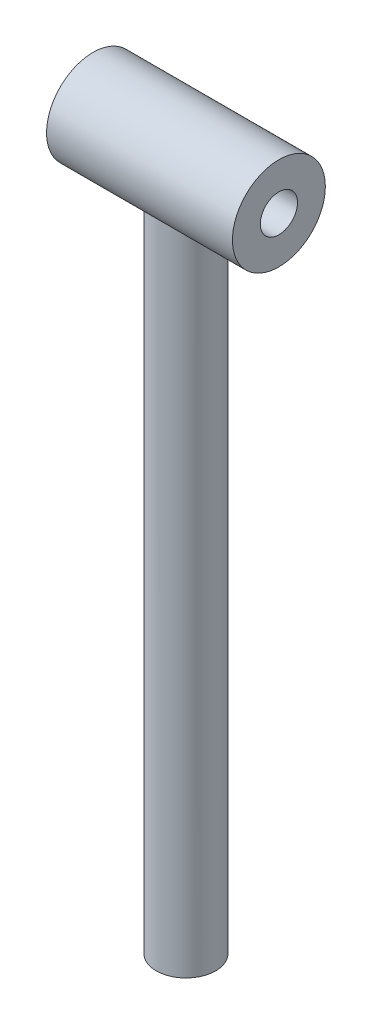
ISO-10303-21;
HEADER;
FILE_DESCRIPTION(('STEP AP214'),'2;1');
FILE_NAME('part.step','',(''),(''),'','','');
FILE_SCHEMA(('AUTOMOTIVE_DESIGN { 1 0 10303 214 1 1 1 1 }'));
ENDSEC;
DATA;
#1=APPLICATION_CONTEXT('core data for automotive mechanical design processes');
#2=APPLICATION_PROTOCOL_DEFINITION('international standard','automotive_design',2000,#1);
#3=PRODUCT_CONTEXT('',#1,'mechanical');
#4=PRODUCT('Part','Part','',(#3));
#5=PRODUCT_RELATED_PRODUCT_CATEGORY('part','',(#4));
#6=PRODUCT_DEFINITION_FORMATION('','',#4);
#7=PRODUCT_DEFINITION_CONTEXT('part definition',#1,'design');
#8=PRODUCT_DEFINITION('design','',#6,#7);
#9=PRODUCT_DEFINITION_SHAPE('','',#8);
#10=(LENGTH_UNIT() NAMED_UNIT(*) SI_UNIT(.MILLI.,.METRE.));
#11=(NAMED_UNIT(*) PLANE_ANGLE_UNIT() SI_UNIT($,.RADIAN.));
#12=(NAMED_UNIT(*) SI_UNIT($,.STERADIAN.) SOLID_ANGLE_UNIT());
#13=UNCERTAINTY_MEASURE_WITH_UNIT(LENGTH_MEASURE(1.E-05),#10,'distance_accuracy_value','');
#14=(GEOMETRIC_REPRESENTATION_CONTEXT(3) GLOBAL_UNCERTAINTY_ASSIGNED_CONTEXT((#13)) GLOBAL_UNIT_ASSIGNED_CONTEXT((#10,
#11,#12)) REPRESENTATION_CONTEXT('',''));
#15=CARTESIAN_POINT('',(0.,0.,0.));
#16=DIRECTION('',(0.,0.,1.));
#17=DIRECTION('',(1.,0.,0.));
#18=AXIS2_PLACEMENT_3D('',#15,#16,#17);
#19=CARTESIAN_POINT('',(-25.,0.,0.));
#20=DIRECTION('',(1.,0.,0.));
#21=DIRECTION('',(0.,0.,-1.));
#22=AXIS2_PLACEMENT_3D('',#19,#20,#21);
#23=CYLINDRICAL_SURFACE('',#22,12.5);
#24=CARTESIAN_POINT('',(0.,-9.6046863561493,8.));
#25=CARTESIAN_POINT('',(-0.197725600196772,-9.6046800226182,8.00000388704961));
#26=CARTESIAN_POINT('',(-0.395415066736677,-9.61081406317906,7.99265931078488));
#27=CARTESIAN_POINT('',(-0.789048350977257,-9.63504143002822,7.96343815709887));
#28=CARTESIAN_POINT('',(-0.984991586034905,-9.65313860686967,7.94155690077122));
#29=CARTESIAN_POINT('',(-1.37365233767129,-9.70049673664764,7.88363816772753));
#30=CARTESIAN_POINT('',(-1.56636511820122,-9.72977279937815,7.84758152908222));
#31=CARTESIAN_POINT('',(-1.94702601705191,-9.79825621718616,7.76190541787049));
#32=CARTESIAN_POINT('',(-2.1349717112703,-9.83746851779271,7.71227919038429));
#33=CARTESIAN_POINT('',(-2.5032205789313,-9.92392883200194,7.6006948964739));
#34=CARTESIAN_POINT('',(-2.68357883488757,-9.9710981654028,7.53885664999728));
#35=CARTESIAN_POINT('',(-3.03783429520806,-10.0722191297971,7.4032125442021));
#36=CARTESIAN_POINT('',(-3.21172899354017,-10.1261733565952,7.32940210134052));
#37=CARTESIAN_POINT('',(-3.55243957989145,-10.239336126136,7.17046077766628));
#38=CARTESIAN_POINT('',(-3.71925646235044,-10.2985439271088,7.08533149415556));
#39=CARTESIAN_POINT('',(-4.04545198058569,-10.4207875583844,6.90428261047693));
#40=CARTESIAN_POINT('',(-4.20483038791468,-10.4838235061191,6.80836267921935));
#41=CARTESIAN_POINT('',(-4.53785857827467,-10.6214887776417,6.59186416473939));
#42=CARTESIAN_POINT('',(-4.71033412428832,-10.6964959314748,6.4697171190941));
#43=CARTESIAN_POINT('',(-5.04472480598659,-10.8479041468059,6.2125076568593));
#44=CARTESIAN_POINT('',(-5.20663912822222,-10.9243053150954,6.07744424739385));
#45=CARTESIAN_POINT('',(-5.51951526340834,-11.0768398375076,5.79477593186786));
#46=CARTESIAN_POINT('',(-5.67046880133186,-11.152972948833,5.6471617292005));
#47=CARTESIAN_POINT('',(-5.96071299642342,-11.3033043476129,5.33990384764399));
#48=CARTESIAN_POINT('',(-6.10000131832306,-11.3775022456181,5.1802577721806));
#49=CARTESIAN_POINT('',(-6.38339624036648,-11.531775454998,4.82801566647635));
#50=CARTESIAN_POINT('',(-6.525796349129,-11.6113698959758,4.63382846333408));
#51=CARTESIAN_POINT('',(-6.7934836287544,-11.7638994954869,4.23165408926023));
#52=CARTESIAN_POINT('',(-6.91877858360741,-11.8368376780198,4.02367325980535));
#53=CARTESIAN_POINT('',(-7.15088819859243,-11.9739901809429,3.59501932436501));
#54=CARTESIAN_POINT('',(-7.25771200439044,-12.0382088152626,3.37435257212809));
#55=CARTESIAN_POINT('',(-7.45145003510304,-12.1559939594901,2.92172176893672));
#56=CARTESIAN_POINT('',(-7.53836810284526,-12.2095625251433,2.68975990901972));
#57=CARTESIAN_POINT('',(-7.68280804189634,-12.2992963215491,2.24141452007464));
#58=CARTESIAN_POINT('',(-7.74246249942322,-12.3367006592974,2.02596537639096));
#59=CARTESIAN_POINT('',(-7.84375281295922,-12.4005204409905,1.58926521631049));
#60=CARTESIAN_POINT('',(-7.88538981670431,-12.4269365848938,1.36801457042972));
#61=CARTESIAN_POINT('',(-7.94989374186597,-12.4679666159666,0.921918760700583));
#62=CARTESIAN_POINT('',(-7.97277820171314,-12.4825915307482,0.697077156468539));
#63=CARTESIAN_POINT('',(-7.99941512202651,-12.4996213330463,0.245812250429379));
#64=CARTESIAN_POINT('',(-8.00316995271175,-12.5020277344736,0.0193891480560831));
#65=CARTESIAN_POINT('',(-7.99231252724628,-12.4950812199824,-0.400893437867219));
#66=CARTESIAN_POINT('',(-7.98021101767946,-12.487335733036,-0.594850745822642));
#67=CARTESIAN_POINT('',(-7.94201442113545,-12.4629601154022,-0.980819611775457));
#68=CARTESIAN_POINT('',(-7.91591953627539,-12.4463301130408,-1.1728311978356));
#69=CARTESIAN_POINT('',(-7.85008372739814,-12.4045624044027,-1.55354755319252));
#70=CARTESIAN_POINT('',(-7.81034294621034,-12.3794247871738,-1.74225235707912));
#71=CARTESIAN_POINT('',(-7.71771136452407,-12.3211920204549,-2.11514693823723));
#72=CARTESIAN_POINT('',(-7.66482000423627,-12.2880965322189,-2.29933652293968));
#73=CARTESIAN_POINT('',(-7.54647689747877,-12.2146288964276,-2.66215988107009));
#74=CARTESIAN_POINT('',(-7.48102392163167,-12.1742560366756,-2.84079310871963));
#75=CARTESIAN_POINT('',(-7.33821812713874,-12.0870286553796,-3.1916247420054));
#76=CARTESIAN_POINT('',(-7.26086137202661,-12.0401719902213,-3.36382099549716));
#77=CARTESIAN_POINT('',(-7.01197471469959,-11.8911742872739,-3.86952150331715));
#78=CARTESIAN_POINT('',(-6.82354379373143,-11.7805518194237,-4.19239355200605));
#79=CARTESIAN_POINT('',(-6.3804936170196,-11.5292338797418,-4.84396019729704));
#80=CARTESIAN_POINT('',(-6.12050477960114,-11.3865030596202,-5.16817471493981));
#81=CARTESIAN_POINT('',(-5.55536680902178,-11.092953716653,-5.77138756468637));
#82=CARTESIAN_POINT('',(-5.25015002310992,-10.942123297585,-6.050316825408));
#83=CARTESIAN_POINT('',(-4.73932979529577,-10.7090671250375,-6.44935384430135));
#84=CARTESIAN_POINT('',(-4.54729202134288,-10.6252167129154,-6.58619832941964));
#85=CARTESIAN_POINT('',(-4.1505500576104,-10.4615672246572,-6.84315545853075));
#86=CARTESIAN_POINT('',(-3.94584332381373,-10.3817689681177,-6.96326472612617));
#87=CARTESIAN_POINT('',(-3.52483551139654,-10.2291757496816,-7.18554998841391));
#88=CARTESIAN_POINT('',(-3.30855181783022,-10.1563707214354,-7.28775193988248));
#89=CARTESIAN_POINT('',(-2.86505450801369,-10.0206809711879,-7.47322990364301));
#90=CARTESIAN_POINT('',(-2.63784580108713,-9.95779184669428,-7.55651432227513));
#91=CARTESIAN_POINT('',(-2.23691148154315,-9.86036989003484,-7.68294413656101));
#92=CARTESIAN_POINT('',(-2.06541786352255,-9.82277440394735,-7.73084786088926));
#93=CARTESIAN_POINT('',(-1.71813529183846,-9.75566461654105,-7.81536471742986));
#94=CARTESIAN_POINT('',(-1.54234744369151,-9.72614825870382,-7.85198072319804));
#95=CARTESIAN_POINT('',(-1.18765600631265,-9.67624640712603,-7.91339530208103));
#96=CARTESIAN_POINT('',(-1.00875654042721,-9.65584966318782,-7.93820843795767));
#97=CARTESIAN_POINT('',(-0.648830483915172,-9.62490744737032,-7.9756975959704));
#98=CARTESIAN_POINT('',(-0.467803867918943,-9.61436209310546,-7.98837347320142));
#99=CARTESIAN_POINT('',(-0.10445691162552,-9.60353274822213,-8.0013894356638));
#100=CARTESIAN_POINT('',(0.0778656751530899,-9.60327937136342,-8.00169271829601));
#101=CARTESIAN_POINT('',(0.441823235032094,-9.61312186767659,-7.9898651619313));
#102=CARTESIAN_POINT('',(0.623458204489919,-9.62321779559588,-7.97773425715801));
#103=CARTESIAN_POINT('',(0.98478245835547,-9.65335964957941,-7.94123436500593));
#104=CARTESIAN_POINT('',(1.16447023505333,-9.67341279135471,-7.91685650245258));
#105=CARTESIAN_POINT('',(1.52054120768861,-9.72270244992421,-7.85624444671896));
#106=CARTESIAN_POINT('',(1.69692432996024,-9.75193917117692,-7.8200099895688));
#107=CARTESIAN_POINT('',(2.0405887010998,-9.81765413413996,-7.73733619889747));
#108=CARTESIAN_POINT('',(2.20798686784733,-9.85391121408515,-7.69120477729455));
#109=CARTESIAN_POINT('',(2.53803206466442,-9.93307177212999,-7.58869392342574));
#110=CARTESIAN_POINT('',(2.70067746908008,-9.97597749344876,-7.53231103124677));
#111=CARTESIAN_POINT('',(3.18055171777876,-10.1129601432431,-7.34856330262676));
#112=CARTESIAN_POINT('',(3.48989592004989,-10.2153385294484,-7.20655602899304));
#113=CARTESIAN_POINT('',(4.14252082425315,-10.4547066612176,-6.85582604529923));
#114=CARTESIAN_POINT('',(4.48065605800564,-10.5945526670235,-6.63949361612554));
#115=CARTESIAN_POINT('',(4.9596286918451,-10.8086814783019,-6.28028565540312));
#116=CARTESIAN_POINT('',(5.11470275117123,-10.8808485216551,-6.15464137769998));
#117=CARTESIAN_POINT('',(5.41508516614057,-11.0252335921494,-5.89208292453987));
#118=CARTESIAN_POINT('',(5.56039181859689,-11.0974516259747,-5.75516679277134));
#119=CARTESIAN_POINT('',(5.86606290707525,-11.2534631500141,-5.44471893579577));
#120=CARTESIAN_POINT('',(6.02439522757172,-11.3369869557452,-5.26904432655867));
#121=CARTESIAN_POINT('',(6.32566492543723,-11.499912697616,-4.90327174352695));
#122=CARTESIAN_POINT('',(6.46860740064844,-11.5793159941198,-4.71317858162136));
#123=CARTESIAN_POINT('',(6.73791834469328,-11.7318899419711,-4.31941118118611));
#124=CARTESIAN_POINT('',(6.8642971976028,-11.8050644880651,-4.11574557349624));
#125=CARTESIAN_POINT('',(7.09923704145455,-11.9432046793099,-3.69576590473051));
#126=CARTESIAN_POINT('',(7.2078030318403,-12.0081726265819,-3.4794554158239));
#127=CARTESIAN_POINT('',(7.38591155749333,-12.1160113437714,-3.07995386112857));
#128=CARTESIAN_POINT('',(7.45891622551881,-12.1607029031521,-2.89879034317557));
#129=CARTESIAN_POINT('',(7.59188984949724,-12.2427141426102,-2.53013556336537));
#130=CARTESIAN_POINT('',(7.65186135698465,-12.2800352654857,-2.3426455483806));
#131=CARTESIAN_POINT('',(7.75805859765762,-12.3464876928852,-1.96251031565213));
#132=CARTESIAN_POINT('',(7.80429272114038,-12.3756239958053,-1.76986832325176));
#133=CARTESIAN_POINT('',(7.88247522688887,-12.4250753623848,-1.38057789031371));
#134=CARTESIAN_POINT('',(7.91442333704043,-12.4453902580174,-1.18392937353598));
#135=CARTESIAN_POINT('',(7.96367028398974,-12.4767656886106,-0.787400984972029));
#136=CARTESIAN_POINT('',(7.98092016710514,-12.4877952966872,-0.58751255703875));
#137=CARTESIAN_POINT('',(8.00033730876319,-12.5002136377997,-0.186702845808624));
#138=CARTESIAN_POINT('',(8.00250456625723,-12.5016023701653,0.0142184375600307));
#139=CARTESIAN_POINT('',(7.99172381568466,-12.4947041877026,0.415500618797145));
#140=CARTESIAN_POINT('',(7.97877470764339,-12.4864165687541,0.615861474821392));
#141=CARTESIAN_POINT('',(7.93795113809955,-12.4603700308977,1.01442633765399));
#142=CARTESIAN_POINT('',(7.91007704169856,-12.4426113436753,1.21263039710182));
#143=CARTESIAN_POINT('',(7.84162975007685,-12.3992135590859,1.59518720950374));
#144=CARTESIAN_POINT('',(7.80179172488414,-12.3740319166324,1.77972452683804));
#145=CARTESIAN_POINT('',(7.70951887081973,-12.316062380405,2.14446247288757));
#146=CARTESIAN_POINT('',(7.65707972124123,-12.2832718778178,2.32466159074256));
#147=CARTESIAN_POINT('',(7.54019690375797,-12.2107522263372,2.67961489932874));
#148=CARTESIAN_POINT('',(7.47575685439303,-12.1710251691951,2.85437071284688));
#149=CARTESIAN_POINT('',(7.33545847539076,-12.0853574866417,3.19772813520566));
#150=CARTESIAN_POINT('',(7.25959572077004,-12.0394144539581,3.36632732747658));
#151=CARTESIAN_POINT('',(7.0909750666637,-11.9384682088018,3.70907431583341));
#152=CARTESIAN_POINT('',(6.99737526661988,-11.8830433266843,3.88268451181549));
#153=CARTESIAN_POINT('',(6.79847980604452,-11.7670225760137,4.22128876385181));
#154=CARTESIAN_POINT('',(6.69317916990882,-11.7064245101999,4.38627911026346));
#155=CARTESIAN_POINT('',(6.3606795463699,-11.5184479116768,4.86762120533803));
#156=CARTESIAN_POINT('',(6.11685950559318,-11.384872660539,5.17039100884835));
#157=CARTESIAN_POINT('',(5.70187014334503,-11.1689121379135,5.61590480408733));
#158=CARTESIAN_POINT('',(5.54361098946585,-11.0887809055014,5.7721546635046));
#159=CARTESIAN_POINT('',(5.21476992781338,-10.9280935314134,6.07087029042937));
#160=CARTESIAN_POINT('',(5.0441908447182,-10.8475374910378,6.21333920018025));
#161=CARTESIAN_POINT('',(4.69120324000964,-10.6879657071392,6.48398736961392));
#162=CARTESIAN_POINT('',(4.50878880050179,-10.6089507602753,6.61215939212992));
#163=CARTESIAN_POINT('',(4.13283415340061,-10.4547062651707,6.85343947004541));
#164=CARTESIAN_POINT('',(3.93929447499547,-10.3794765371993,6.96654824110292));
#165=CARTESIAN_POINT('',(3.3983086210433,-10.1831798904753,7.25264708299247));
#166=CARTESIAN_POINT('',(3.04018060175007,-10.0680090040754,7.41028140377249));
#167=CARTESIAN_POINT('',(2.4835251506431,-9.91896967373582,7.60728888827492));
#168=CARTESIAN_POINT('',(2.29487664236248,-9.87326787401481,7.66635480677079));
#169=CARTESIAN_POINT('',(1.91181936612791,-9.79132699340353,7.7707339317993));
#170=CARTESIAN_POINT('',(1.71741274362258,-9.75508443622121,7.81605219162274));
#171=CARTESIAN_POINT('',(1.27229068402663,-9.68548560966462,7.90223108914849));
#172=CARTESIAN_POINT('',(1.02020534645759,-9.65539166625939,7.93878943181892));
#173=CARTESIAN_POINT('',(0.512059881174065,-9.61499589424646,7.98767167132188));
#174=CARTESIAN_POINT('',(0.255999655078131,-9.60469455631041,7.99999496735193));
#175=CARTESIAN_POINT('',(0.,-9.6046863561493,8.));
#176=B_SPLINE_CURVE_WITH_KNOTS('',3,(#24,#25,#26,#27,#28,#29,#30,#31,#32,#33,#34,#35,#36,#37,
#38,#39,#40,#41,#42,#43,#44,#45,#46,#47,#48,#49,#50,#51,#52,#53,#54,#55,#56,#57,#58,#59,#60,#61,
#62,#63,#64,#65,#66,#67,#68,#69,#70,#71,#72,#73,#74,#75,#76,#77,#78,#79,#80,#81,#82,#83,#84,#85,
#86,#87,#88,#89,#90,#91,#92,#93,#94,#95,#96,#97,#98,#99,#100,#101,#102,#103,#104,#105,#106,#107,
#108,#109,#110,#111,#112,#113,#114,#115,#116,#117,#118,#119,#120,#121,#122,#123,#124,#125,#126,
#127,#128,#129,#130,#131,#132,#133,#134,#135,#136,#137,#138,#139,#140,#141,#142,#143,#144,#145,
#146,#147,#148,#149,#150,#151,#152,#153,#154,#155,#156,#157,#158,#159,#160,#161,#162,#163,#164,
#165,#166,#167,#168,#169,#170,#171,#172,#173,#174,#175),.UNSPECIFIED.,.T.,.F.,(4,2,2,2,2,2,2,2,
2,2,2,2,2,2,2,2,2,2,2,2,2,2,2,2,2,2,2,2,2,2,2,2,2,2,2,2,2,2,2,2,2,2,2,2,2,2,2,2,2,2,2,2,2,2,2,2,
2,2,2,2,2,2,2,2,2,2,2,2,2,2,2,2,2,2,2,4),(0.,0.592887257792054,1.18596544011631,1.7798481026967,
2.37402693903235,2.96264219134953,3.55148332862861,4.14024145733593,4.72901765584998,
5.40115383271366,6.07334171802163,6.74603191700079,7.41885646202976,8.1786945633341,
8.93818572655349,9.69729975745942,10.4562671166857,11.1352520736919,11.8141937720764,
12.4924997590449,13.1707216998008,13.7534852964555,14.3362404760319,14.9189895561902,
15.5017634468593,16.0845944014255,16.667618508472,17.8328502774094,19.1462489635711,
20.4616324653791,21.2116852771477,21.9618891966417,22.7109965288693,23.4597703279367,
24.0052028797464,24.5504964639104,25.0951154907878,25.639741019716,26.1859864334609,
26.7322347368375,27.2788794698898,27.8255363740224,28.3571657926284,28.8889749725232,
29.9520403669172,31.2224068519399,31.8586887757296,32.4950813645876,33.2466132492458,
33.9978954202009,34.748704320704,35.4993021337692,36.0997942587923,36.700168717855,
37.3001757325868,37.9001941755212,38.5022033049345,39.1042124762017,39.706265456684,
40.3083037101567,40.8790573843758,41.4500070400704,42.0207848195797,42.591784281366,
43.2057638082978,43.8200054271953,45.0483270040273,45.7569311916436,46.4653734251422,
47.1741726641367,47.8829382159178,49.1008754288357,49.7089421129551,50.3167850155951,
51.0843900742561,51.8520141621027),.UNSPECIFIED.);
#177=CARTESIAN_POINT('',(0.,-9.6046863561493,8.));
#178=VERTEX_POINT('',#177);
#179=EDGE_CURVE('E10',#178,#178,#176,.T.);
#180=ORIENTED_EDGE('',*,*,#179,.F.);
#181=EDGE_LOOP('',(#180));
#182=FACE_BOUND('',#181,.T.);
#183=CARTESIAN_POINT('',(-25.,0.,0.));
#184=DIRECTION('',(1.,0.,0.));
#185=DIRECTION('',(0.,0.,-1.));
#186=AXIS2_PLACEMENT_3D('',#183,#184,#185);
#187=CIRCLE('',#186,12.5);
#188=CARTESIAN_POINT('',(-25.,0.,-12.5));
#189=VERTEX_POINT('',#188);
#190=EDGE_CURVE('E41',#189,#189,#187,.T.);
#191=ORIENTED_EDGE('',*,*,#190,.T.);
#192=EDGE_LOOP('',(#191));
#193=FACE_BOUND('',#192,.T.);
#194=CARTESIAN_POINT('',(25.,0.,0.));
#195=DIRECTION('',(1.,0.,0.));
#196=DIRECTION('',(0.,0.,-1.));
#197=AXIS2_PLACEMENT_3D('',#194,#195,#196);
#198=CIRCLE('',#197,12.5);
#199=CARTESIAN_POINT('',(25.,0.,-12.5));
#200=VERTEX_POINT('',#199);
#201=EDGE_CURVE('E89',#200,#200,#198,.T.);
#202=ORIENTED_EDGE('',*,*,#201,.F.);
#203=EDGE_LOOP('',(#202));
#204=FACE_BOUND('',#203,.T.);
#205=ADVANCED_FACE('F37',(#182,#193,#204),#23,.T.);
#206=CARTESIAN_POINT('',(-25.,0.,0.));
#207=DIRECTION('',(1.,0.,0.));
#208=DIRECTION('',(0.,0.,-1.));
#209=AXIS2_PLACEMENT_3D('',#206,#207,#208);
#210=PLANE('',#209);
#211=CARTESIAN_POINT('',(-25.,0.,0.));
#212=DIRECTION('',(1.,0.,0.));
#213=DIRECTION('',(0.,0.,-1.));
#214=AXIS2_PLACEMENT_3D('',#211,#212,#213);
#215=CIRCLE('',#214,5.);
#216=CARTESIAN_POINT('',(-25.,0.,-5.));
#217=VERTEX_POINT('',#216);
#218=EDGE_CURVE('E51',#217,#217,#215,.T.);
#219=ORIENTED_EDGE('',*,*,#218,.T.);
#220=EDGE_LOOP('',(#219));
#221=FACE_BOUND('',#220,.T.);
#222=ORIENTED_EDGE('',*,*,#190,.F.);
#223=EDGE_LOOP('',(#222));
#224=FACE_BOUND('',#223,.T.);
#225=ADVANCED_FACE('F73',(#221,#224),#210,.F.);
#226=CARTESIAN_POINT('',(-25.,0.,0.));
#227=DIRECTION('',(1.,0.,0.));
#228=DIRECTION('',(0.,0.,-1.));
#229=AXIS2_PLACEMENT_3D('',#226,#227,#228);
#230=CYLINDRICAL_SURFACE('',#229,5.);
#231=ORIENTED_EDGE('',*,*,#218,.F.);
#232=EDGE_LOOP('',(#231));
#233=FACE_BOUND('',#232,.T.);
#234=CARTESIAN_POINT('',(25.,0.,0.));
#235=DIRECTION('',(1.,0.,0.));
#236=DIRECTION('',(0.,0.,-1.));
#237=AXIS2_PLACEMENT_3D('',#234,#235,#236);
#238=CIRCLE('',#237,5.);
#239=CARTESIAN_POINT('',(25.,0.,-5.));
#240=VERTEX_POINT('',#239);
#241=EDGE_CURVE('E59',#240,#240,#238,.T.);
#242=ORIENTED_EDGE('',*,*,#241,.T.);
#243=EDGE_LOOP('',(#242));
#244=FACE_BOUND('',#243,.T.);
#245=ADVANCED_FACE('F70',(#233,#244),#230,.F.);
#246=CARTESIAN_POINT('',(25.,0.,0.));
#247=DIRECTION('',(1.,0.,0.));
#248=DIRECTION('',(0.,0.,-1.));
#249=AXIS2_PLACEMENT_3D('',#246,#247,#248);
#250=PLANE('',#249);
#251=ORIENTED_EDGE('',*,*,#201,.T.);
#252=EDGE_LOOP('',(#251));
#253=FACE_BOUND('',#252,.T.);
#254=ORIENTED_EDGE('',*,*,#241,.F.);
#255=EDGE_LOOP('',(#254));
#256=FACE_BOUND('',#255,.T.);
#257=ADVANCED_FACE('F67',(#253,#256),#250,.T.);
#258=CARTESIAN_POINT('',(0.,-185.,0.));
#259=DIRECTION('',(0.,1.,0.));
#260=DIRECTION('',(0.,0.,1.));
#261=AXIS2_PLACEMENT_3D('',#258,#259,#260);
#262=CYLINDRICAL_SURFACE('',#261,8.);
#263=ORIENTED_EDGE('',*,*,#179,.T.);
#264=EDGE_LOOP('',(#263));
#265=FACE_BOUND('',#264,.T.);
#266=CARTESIAN_POINT('',(0.,-185.,0.));
#267=DIRECTION('',(0.,1.,0.));
#268=DIRECTION('',(0.,0.,1.));
#269=AXIS2_PLACEMENT_3D('',#266,#267,#268);
#270=CIRCLE('',#269,8.);
#271=CARTESIAN_POINT('',(0.,-185.,8.));
#272=VERTEX_POINT('',#271);
#273=EDGE_CURVE('E58',#272,#272,#270,.T.);
#274=ORIENTED_EDGE('',*,*,#273,.T.);
#275=EDGE_LOOP('',(#274));
#276=FACE_BOUND('',#275,.T.);
#277=ADVANCED_FACE('F61',(#265,#276),#262,.T.);
#278=CARTESIAN_POINT('',(0.,-185.,0.));
#279=DIRECTION('',(0.,1.,0.));
#280=DIRECTION('',(0.,0.,1.));
#281=AXIS2_PLACEMENT_3D('',#278,#279,#280);
#282=PLANE('',#281);
#283=ORIENTED_EDGE('',*,*,#273,.F.);
#284=EDGE_LOOP('',(#283));
#285=FACE_BOUND('',#284,.T.);
#286=ADVANCED_FACE('F66',(#285),#282,.F.);
#287=CLOSED_SHELL('',(#205,#225,#245,#257,#277,#286));
#288=MANIFOLD_SOLID_BREP('B2',#287);
#289=ADVANCED_BREP_SHAPE_REPRESENTATION('',(#18,#288),#14);
#290=SHAPE_DEFINITION_REPRESENTATION(#9,#289);
ENDSEC;
END-ISO-10303-21;
